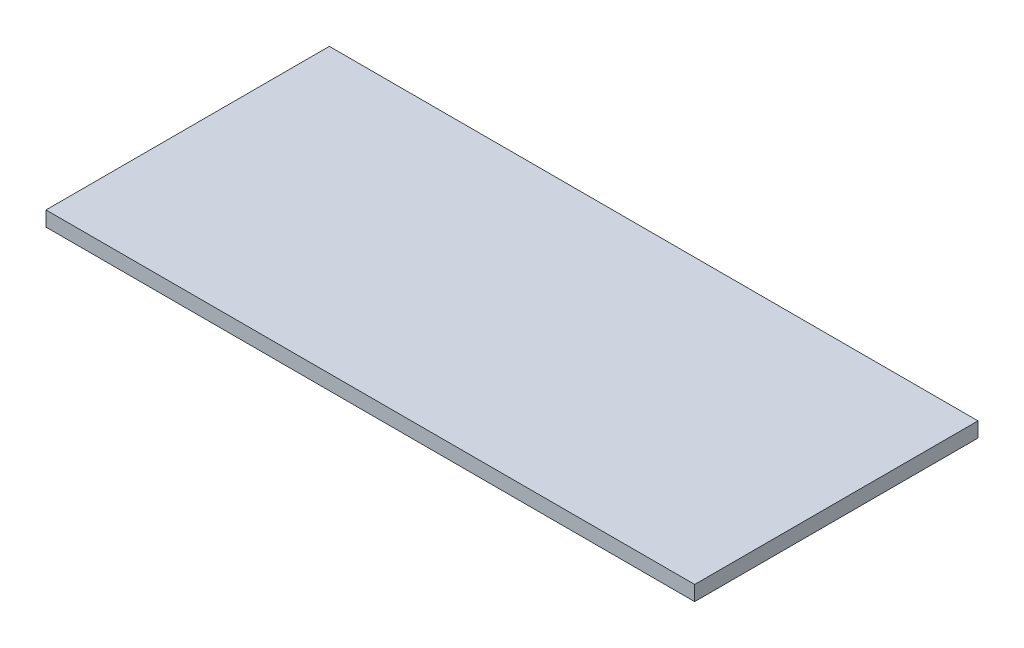
ISO-10303-21;
HEADER;
FILE_DESCRIPTION(('STEP AP214'),'2;1');
FILE_NAME('part.step','',(''),(''),'','','');
FILE_SCHEMA(('AUTOMOTIVE_DESIGN { 1 0 10303 214 1 1 1 1 }'));
ENDSEC;
DATA;
#1=APPLICATION_CONTEXT('core data for automotive mechanical design processes');
#2=APPLICATION_PROTOCOL_DEFINITION('international standard','automotive_design',2000,#1);
#3=PRODUCT_CONTEXT('',#1,'mechanical');
#4=PRODUCT('Part','Part','',(#3));
#5=PRODUCT_RELATED_PRODUCT_CATEGORY('part','',(#4));
#6=PRODUCT_DEFINITION_FORMATION('','',#4);
#7=PRODUCT_DEFINITION_CONTEXT('part definition',#1,'design');
#8=PRODUCT_DEFINITION('design','',#6,#7);
#9=PRODUCT_DEFINITION_SHAPE('','',#8);
#10=(LENGTH_UNIT() NAMED_UNIT(*) SI_UNIT(.MILLI.,.METRE.));
#11=(NAMED_UNIT(*) PLANE_ANGLE_UNIT() SI_UNIT($,.RADIAN.));
#12=(NAMED_UNIT(*) SI_UNIT($,.STERADIAN.) SOLID_ANGLE_UNIT());
#13=UNCERTAINTY_MEASURE_WITH_UNIT(LENGTH_MEASURE(1.E-05),#10,'distance_accuracy_value','');
#14=(GEOMETRIC_REPRESENTATION_CONTEXT(3) GLOBAL_UNCERTAINTY_ASSIGNED_CONTEXT((#13)) GLOBAL_UNIT_ASSIGNED_CONTEXT((#10,
#11,#12)) REPRESENTATION_CONTEXT('',''));
#15=CARTESIAN_POINT('',(0.,0.,0.));
#16=DIRECTION('',(0.,0.,1.));
#17=DIRECTION('',(1.,0.,0.));
#18=AXIS2_PLACEMENT_3D('',#15,#16,#17);
#19=CARTESIAN_POINT('',(0.,20.,0.));
#20=DIRECTION('',(1.,0.,0.));
#21=DIRECTION('',(0.,0.,-1.));
#22=AXIS2_PLACEMENT_3D('',#19,#20,#21);
#23=PLANE('',#22);
#24=DIRECTION('',(0.,0.,1.));
#25=VECTOR('',#24,1.);
#26=CARTESIAN_POINT('',(0.,0.,0.));
#27=LINE('',#26,#25);
#28=CARTESIAN_POINT('',(0.,0.,-380.));
#29=VERTEX_POINT('',#28);
#30=CARTESIAN_POINT('',(0.,0.,0.));
#31=VERTEX_POINT('',#30);
#32=EDGE_CURVE('E102',#29,#31,#27,.T.);
#33=ORIENTED_EDGE('',*,*,#32,.T.);
#34=DIRECTION('',(0.,-1.,0.));
#35=VECTOR('',#34,1.);
#36=CARTESIAN_POINT('',(0.,20.,0.));
#37=LINE('',#36,#35);
#38=CARTESIAN_POINT('',(0.,20.,0.));
#39=VERTEX_POINT('',#38);
#40=EDGE_CURVE('E11',#39,#31,#37,.T.);
#41=ORIENTED_EDGE('',*,*,#40,.F.);
#42=DIRECTION('',(0.,0.,1.));
#43=VECTOR('',#42,1.);
#44=CARTESIAN_POINT('',(0.,20.,0.));
#45=LINE('',#44,#43);
#46=CARTESIAN_POINT('',(0.,20.,-380.));
#47=VERTEX_POINT('',#46);
#48=EDGE_CURVE('E90',#47,#39,#45,.T.);
#49=ORIENTED_EDGE('',*,*,#48,.F.);
#50=DIRECTION('',(0.,-1.,0.));
#51=VECTOR('',#50,1.);
#52=CARTESIAN_POINT('',(0.,20.,-380.));
#53=LINE('',#52,#51);
#54=EDGE_CURVE('E98',#47,#29,#53,.T.);
#55=ORIENTED_EDGE('',*,*,#54,.T.);
#56=EDGE_LOOP('',(#33,#41,#49,#55));
#57=FACE_BOUND('',#56,.T.);
#58=ADVANCED_FACE('F39',(#57),#23,.F.);
#59=CARTESIAN_POINT('',(0.,20.,0.));
#60=DIRECTION('',(0.,0.,-1.));
#61=DIRECTION('',(-1.,0.,0.));
#62=AXIS2_PLACEMENT_3D('',#59,#60,#61);
#63=PLANE('',#62);
#64=DIRECTION('',(1.,0.,0.));
#65=VECTOR('',#64,1.);
#66=CARTESIAN_POINT('',(0.,0.,0.));
#67=LINE('',#66,#65);
#68=CARTESIAN_POINT('',(870.,0.,0.));
#69=VERTEX_POINT('',#68);
#70=EDGE_CURVE('E94',#31,#69,#67,.T.);
#71=ORIENTED_EDGE('',*,*,#70,.T.);
#72=DIRECTION('',(0.,-1.,0.));
#73=VECTOR('',#72,1.);
#74=CARTESIAN_POINT('',(870.,20.,0.));
#75=LINE('',#74,#73);
#76=CARTESIAN_POINT('',(870.,20.,0.));
#77=VERTEX_POINT('',#76);
#78=EDGE_CURVE('E47',#77,#69,#75,.T.);
#79=ORIENTED_EDGE('',*,*,#78,.F.);
#80=DIRECTION('',(1.,0.,0.));
#81=VECTOR('',#80,1.);
#82=CARTESIAN_POINT('',(0.,20.,0.));
#83=LINE('',#82,#81);
#84=EDGE_CURVE('E85',#39,#77,#83,.T.);
#85=ORIENTED_EDGE('',*,*,#84,.F.);
#86=ORIENTED_EDGE('',*,*,#40,.T.);
#87=EDGE_LOOP('',(#71,#79,#85,#86));
#88=FACE_BOUND('',#87,.T.);
#89=ADVANCED_FACE('F93',(#88),#63,.F.);
#90=CARTESIAN_POINT('',(870.,20.,0.));
#91=DIRECTION('',(-1.,0.,0.));
#92=DIRECTION('',(0.,0.,1.));
#93=AXIS2_PLACEMENT_3D('',#90,#91,#92);
#94=PLANE('',#93);
#95=DIRECTION('',(0.,0.,-1.));
#96=VECTOR('',#95,1.);
#97=CARTESIAN_POINT('',(870.,0.,0.));
#98=LINE('',#97,#96);
#99=CARTESIAN_POINT('',(870.,0.,-380.));
#100=VERTEX_POINT('',#99);
#101=EDGE_CURVE('E72',#69,#100,#98,.T.);
#102=ORIENTED_EDGE('',*,*,#101,.T.);
#103=DIRECTION('',(0.,-1.,0.));
#104=VECTOR('',#103,1.);
#105=CARTESIAN_POINT('',(870.,20.,-380.));
#106=LINE('',#105,#104);
#107=CARTESIAN_POINT('',(870.,20.,-380.));
#108=VERTEX_POINT('',#107);
#109=EDGE_CURVE('E95',#108,#100,#106,.T.);
#110=ORIENTED_EDGE('',*,*,#109,.F.);
#111=DIRECTION('',(0.,0.,-1.));
#112=VECTOR('',#111,1.);
#113=CARTESIAN_POINT('',(870.,20.,0.));
#114=LINE('',#113,#112);
#115=EDGE_CURVE('E88',#77,#108,#114,.T.);
#116=ORIENTED_EDGE('',*,*,#115,.F.);
#117=ORIENTED_EDGE('',*,*,#78,.T.);
#118=EDGE_LOOP('',(#102,#110,#116,#117));
#119=FACE_BOUND('',#118,.T.);
#120=ADVANCED_FACE('F96',(#119),#94,.F.);
#121=CARTESIAN_POINT('',(0.,20.,-380.));
#122=DIRECTION('',(0.,0.,1.));
#123=DIRECTION('',(1.,0.,0.));
#124=AXIS2_PLACEMENT_3D('',#121,#122,#123);
#125=PLANE('',#124);
#126=DIRECTION('',(-1.,0.,0.));
#127=VECTOR('',#126,1.);
#128=CARTESIAN_POINT('',(0.,0.,-380.));
#129=LINE('',#128,#127);
#130=EDGE_CURVE('E78',#100,#29,#129,.T.);
#131=ORIENTED_EDGE('',*,*,#130,.T.);
#132=ORIENTED_EDGE('',*,*,#54,.F.);
#133=DIRECTION('',(-1.,0.,0.));
#134=VECTOR('',#133,1.);
#135=CARTESIAN_POINT('',(0.,20.,-380.));
#136=LINE('',#135,#134);
#137=EDGE_CURVE('E55',#108,#47,#136,.T.);
#138=ORIENTED_EDGE('',*,*,#137,.F.);
#139=ORIENTED_EDGE('',*,*,#109,.T.);
#140=EDGE_LOOP('',(#131,#132,#138,#139));
#141=FACE_BOUND('',#140,.T.);
#142=ADVANCED_FACE('F109',(#141),#125,.F.);
#143=CARTESIAN_POINT('',(0.,20.,0.));
#144=DIRECTION('',(0.,-1.,0.));
#145=DIRECTION('',(0.,0.,-1.));
#146=AXIS2_PLACEMENT_3D('',#143,#144,#145);
#147=PLANE('',#146);
#148=ORIENTED_EDGE('',*,*,#48,.T.);
#149=ORIENTED_EDGE('',*,*,#84,.T.);
#150=ORIENTED_EDGE('',*,*,#115,.T.);
#151=ORIENTED_EDGE('',*,*,#137,.T.);
#152=EDGE_LOOP('',(#148,#149,#150,#151));
#153=FACE_BOUND('',#152,.T.);
#154=ADVANCED_FACE('F86',(#153),#147,.F.);
#155=CARTESIAN_POINT('',(0.,0.,0.));
#156=DIRECTION('',(0.,-1.,0.));
#157=DIRECTION('',(0.,0.,-1.));
#158=AXIS2_PLACEMENT_3D('',#155,#156,#157);
#159=PLANE('',#158);
#160=ORIENTED_EDGE('',*,*,#32,.F.);
#161=ORIENTED_EDGE('',*,*,#130,.F.);
#162=ORIENTED_EDGE('',*,*,#101,.F.);
#163=ORIENTED_EDGE('',*,*,#70,.F.);
#164=EDGE_LOOP('',(#160,#161,#162,#163));
#165=FACE_BOUND('',#164,.T.);
#166=ADVANCED_FACE('F112',(#165),#159,.T.);
#167=CLOSED_SHELL('',(#58,#89,#120,#142,#154,#166));
#168=MANIFOLD_SOLID_BREP('B2',#167);
#169=ADVANCED_BREP_SHAPE_REPRESENTATION('',(#18,#168),#14);
#170=SHAPE_DEFINITION_REPRESENTATION(#9,#169);
ENDSEC;
END-ISO-10303-21;
